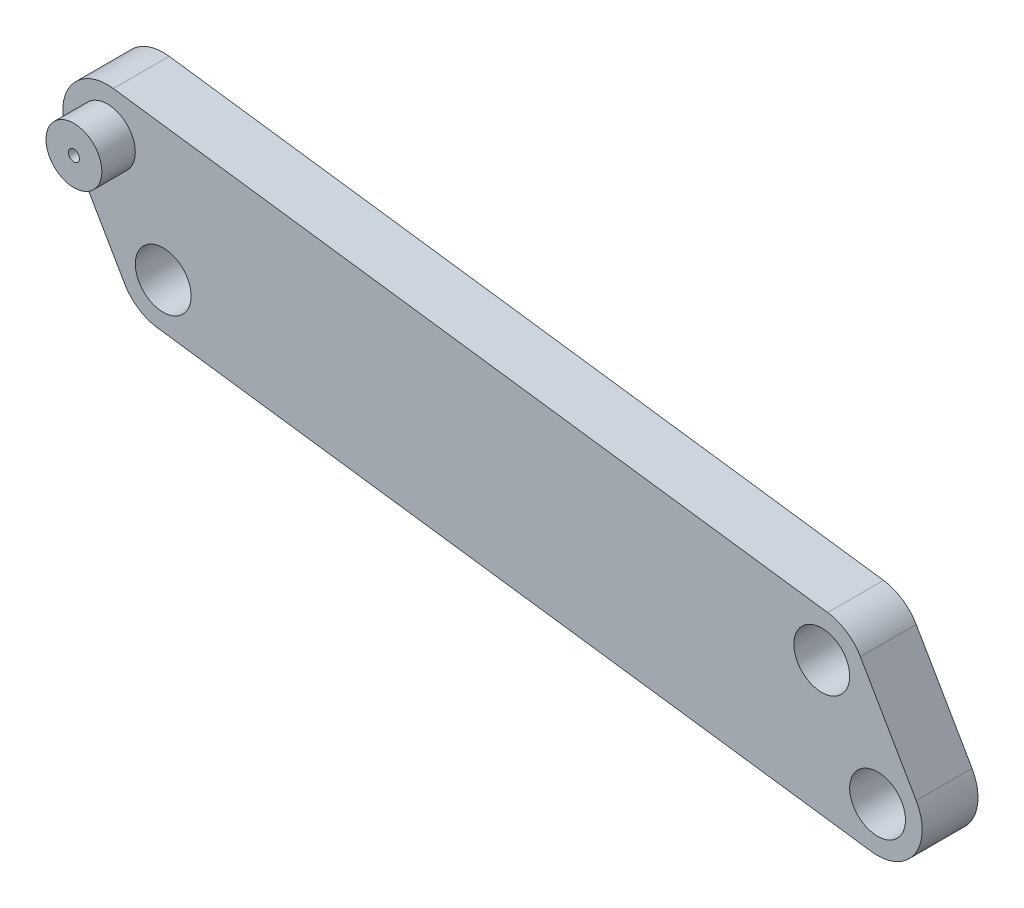
ISO-10303-21;
HEADER;
FILE_DESCRIPTION(('STEP AP214'),'2;1');
FILE_NAME('part.step','',(''),(''),'','','');
FILE_SCHEMA(('AUTOMOTIVE_DESIGN { 1 0 10303 214 1 1 1 1 }'));
ENDSEC;
DATA;
#1=APPLICATION_CONTEXT('core data for automotive mechanical design processes');
#2=APPLICATION_PROTOCOL_DEFINITION('international standard','automotive_design',2000,#1);
#3=PRODUCT_CONTEXT('',#1,'mechanical');
#4=PRODUCT('Part','Part','',(#3));
#5=PRODUCT_RELATED_PRODUCT_CATEGORY('part','',(#4));
#6=PRODUCT_DEFINITION_FORMATION('','',#4);
#7=PRODUCT_DEFINITION_CONTEXT('part definition',#1,'design');
#8=PRODUCT_DEFINITION('design','',#6,#7);
#9=PRODUCT_DEFINITION_SHAPE('','',#8);
#10=(LENGTH_UNIT() NAMED_UNIT(*) SI_UNIT(.MILLI.,.METRE.));
#11=(NAMED_UNIT(*) PLANE_ANGLE_UNIT() SI_UNIT($,.RADIAN.));
#12=(NAMED_UNIT(*) SI_UNIT($,.STERADIAN.) SOLID_ANGLE_UNIT());
#13=UNCERTAINTY_MEASURE_WITH_UNIT(LENGTH_MEASURE(1.E-05),#10,'distance_accuracy_value','');
#14=(GEOMETRIC_REPRESENTATION_CONTEXT(3) GLOBAL_UNCERTAINTY_ASSIGNED_CONTEXT((#13)) GLOBAL_UNIT_ASSIGNED_CONTEXT((#10,
#11,#12)) REPRESENTATION_CONTEXT('',''));
#15=CARTESIAN_POINT('',(0.,0.,0.));
#16=DIRECTION('',(0.,0.,1.));
#17=DIRECTION('',(1.,0.,0.));
#18=AXIS2_PLACEMENT_3D('',#15,#16,#17);
#19=CARTESIAN_POINT('',(-59.,0.,5.));
#20=DIRECTION('',(0.,0.,1.));
#21=DIRECTION('',(1.,0.,0.));
#22=AXIS2_PLACEMENT_3D('',#19,#20,#21);
#23=PLANE('',#22);
#24=CARTESIAN_POINT('',(0.,0.,5.));
#25=DIRECTION('',(0.,0.,1.));
#26=DIRECTION('',(1.,0.,0.));
#27=AXIS2_PLACEMENT_3D('',#24,#25,#26);
#28=CIRCLE('',#27,2.5);
#29=CARTESIAN_POINT('',(2.5,0.,5.));
#30=VERTEX_POINT('',#29);
#31=EDGE_CURVE('E220',#30,#30,#28,.T.);
#32=ORIENTED_EDGE('',*,*,#31,.F.);
#33=EDGE_LOOP('',(#32));
#34=FACE_BOUND('',#33,.T.);
#35=CARTESIAN_POINT('',(-59.,0.,5.));
#36=DIRECTION('',(0.,0.,1.));
#37=DIRECTION('',(1.,0.,0.));
#38=AXIS2_PLACEMENT_3D('',#35,#36,#37);
#39=CIRCLE('',#38,2.5);
#40=CARTESIAN_POINT('',(-56.5,0.,5.));
#41=VERTEX_POINT('',#40);
#42=EDGE_CURVE('E146',#41,#41,#39,.T.);
#43=ORIENTED_EDGE('',*,*,#42,.F.);
#44=EDGE_LOOP('',(#43));
#45=FACE_BOUND('',#44,.T.);
#46=CARTESIAN_POINT('',(-59.,0.,5.));
#47=DIRECTION('',(0.,0.,1.));
#48=DIRECTION('',(1.,0.,0.));
#49=AXIS2_PLACEMENT_3D('',#46,#47,#48);
#50=CIRCLE('',#49,4.00000000000001);
#51=CARTESIAN_POINT('',(-62.4641016151378,-2.00000000000001,5.));
#52=VERTEX_POINT('',#51);
#53=CARTESIAN_POINT('',(-59.5363774707957,-3.96387426753459,5.));
#54=VERTEX_POINT('',#53);
#55=EDGE_CURVE('E164',#52,#54,#50,.T.);
#56=ORIENTED_EDGE('',*,*,#55,.T.);
#57=DIRECTION('',(0.990968566883646,-0.134094367698921,0.));
#58=VECTOR('',#57,1.);
#59=CARTESIAN_POINT('',(4.46362252920436,-12.6241283053789,5.));
#60=LINE('',#59,#58);
#61=CARTESIAN_POINT('',(4.46362252920436,-12.6241283053789,5.));
#62=VERTEX_POINT('',#61);
#63=EDGE_CURVE('E100',#54,#62,#60,.T.);
#64=ORIENTED_EDGE('',*,*,#63,.T.);
#65=CARTESIAN_POINT('',(5.00000000000004,-8.66025403784436,5.));
#66=DIRECTION('',(0.,0.,1.));
#67=DIRECTION('',(1.,0.,0.));
#68=AXIS2_PLACEMENT_3D('',#65,#66,#67);
#69=CIRCLE('',#68,4.);
#70=CARTESIAN_POINT('',(8.46410161513779,-6.66025403784434,5.));
#71=VERTEX_POINT('',#70);
#72=EDGE_CURVE('E185',#62,#71,#69,.T.);
#73=ORIENTED_EDGE('',*,*,#72,.T.);
#74=DIRECTION('',(-0.500000000000005,0.866025403784436,0.));
#75=VECTOR('',#74,1.);
#76=CARTESIAN_POINT('',(3.46410161513775,2.00000000000002,5.));
#77=LINE('',#76,#75);
#78=CARTESIAN_POINT('',(3.46410161513774,2.00000000000002,5.));
#79=VERTEX_POINT('',#78);
#80=EDGE_CURVE('E199',#71,#79,#77,.T.);
#81=ORIENTED_EDGE('',*,*,#80,.T.);
#82=CARTESIAN_POINT('',(0.,0.,5.));
#83=DIRECTION('',(0.,0.,1.));
#84=DIRECTION('',(1.,0.,0.));
#85=AXIS2_PLACEMENT_3D('',#82,#83,#84);
#86=CIRCLE('',#85,4.);
#87=CARTESIAN_POINT('',(0.536377470795685,3.96387426753458,5.));
#88=VERTEX_POINT('',#87);
#89=EDGE_CURVE('E119',#79,#88,#86,.T.);
#90=ORIENTED_EDGE('',*,*,#89,.T.);
#91=DIRECTION('',(-0.990968566883646,0.134094367698921,0.));
#92=VECTOR('',#91,1.);
#93=CARTESIAN_POINT('',(-63.4636225292043,12.624128305379,5.));
#94=LINE('',#93,#92);
#95=CARTESIAN_POINT('',(-63.4636225292043,12.624128305379,5.));
#96=VERTEX_POINT('',#95);
#97=EDGE_CURVE('E113',#88,#96,#94,.T.);
#98=ORIENTED_EDGE('',*,*,#97,.T.);
#99=CARTESIAN_POINT('',(-64.,8.66025403784439,5.));
#100=DIRECTION('',(0.,0.,1.));
#101=DIRECTION('',(1.,0.,0.));
#102=AXIS2_PLACEMENT_3D('',#99,#100,#101);
#103=CIRCLE('',#102,4.);
#104=CARTESIAN_POINT('',(-67.4641016151377,6.6602540378444,5.));
#105=VERTEX_POINT('',#104);
#106=EDGE_CURVE('E117',#96,#105,#103,.T.);
#107=ORIENTED_EDGE('',*,*,#106,.T.);
#108=DIRECTION('',(0.499999999999997,-0.86602540378444,0.));
#109=VECTOR('',#108,1.);
#110=CARTESIAN_POINT('',(-62.4641016151378,-2.00000000000001,5.));
#111=LINE('',#110,#109);
#112=EDGE_CURVE('E57',#105,#52,#111,.T.);
#113=ORIENTED_EDGE('',*,*,#112,.T.);
#114=EDGE_LOOP('',(#56,#64,#73,#81,#90,#98,#107,#113));
#115=FACE_BOUND('',#114,.T.);
#116=CARTESIAN_POINT('',(-64.,8.66025403784439,5.));
#117=DIRECTION('',(0.,0.,1.));
#118=DIRECTION('',(1.,0.,0.));
#119=AXIS2_PLACEMENT_3D('',#116,#117,#118);
#120=CIRCLE('',#119,2.5);
#121=CARTESIAN_POINT('',(-61.5,8.66025403784439,5.));
#122=VERTEX_POINT('',#121);
#123=EDGE_CURVE('E213',#122,#122,#120,.T.);
#124=ORIENTED_EDGE('',*,*,#123,.F.);
#125=EDGE_LOOP('',(#124));
#126=FACE_BOUND('',#125,.T.);
#127=CARTESIAN_POINT('',(5.00000000000004,-8.66025403784436,5.));
#128=DIRECTION('',(0.,0.,1.));
#129=DIRECTION('',(1.,0.,0.));
#130=AXIS2_PLACEMENT_3D('',#127,#128,#129);
#131=CIRCLE('',#130,2.5);
#132=CARTESIAN_POINT('',(7.50000000000004,-8.66025403784436,5.));
#133=VERTEX_POINT('',#132);
#134=EDGE_CURVE('E225',#133,#133,#131,.T.);
#135=ORIENTED_EDGE('',*,*,#134,.F.);
#136=EDGE_LOOP('',(#135));
#137=FACE_BOUND('',#136,.T.);
#138=ADVANCED_FACE('F39',(#34,#45,#115,#126,#137),#23,.T.);
#139=CARTESIAN_POINT('',(-59.,0.,0.));
#140=DIRECTION('',(0.,0.,1.));
#141=DIRECTION('',(1.,0.,0.));
#142=AXIS2_PLACEMENT_3D('',#139,#140,#141);
#143=PLANE('',#142);
#144=CARTESIAN_POINT('',(-59.,0.,0.));
#145=DIRECTION('',(0.,0.,1.));
#146=DIRECTION('',(1.,0.,0.));
#147=AXIS2_PLACEMENT_3D('',#144,#145,#146);
#148=CIRCLE('',#147,4.00000000000001);
#149=CARTESIAN_POINT('',(-62.4641016151378,-2.00000000000001,0.));
#150=VERTEX_POINT('',#149);
#151=CARTESIAN_POINT('',(-59.5363774707957,-3.96387426753459,0.));
#152=VERTEX_POINT('',#151);
#153=EDGE_CURVE('E141',#150,#152,#148,.T.);
#154=ORIENTED_EDGE('',*,*,#153,.F.);
#155=DIRECTION('',(0.499999999999997,-0.86602540378444,0.));
#156=VECTOR('',#155,1.);
#157=CARTESIAN_POINT('',(-62.4641016151378,-2.00000000000001,0.));
#158=LINE('',#157,#156);
#159=CARTESIAN_POINT('',(-67.4641016151377,6.6602540378444,0.));
#160=VERTEX_POINT('',#159);
#161=EDGE_CURVE('E92',#160,#150,#158,.T.);
#162=ORIENTED_EDGE('',*,*,#161,.F.);
#163=CARTESIAN_POINT('',(-64.,8.66025403784439,0.));
#164=DIRECTION('',(0.,0.,1.));
#165=DIRECTION('',(1.,0.,0.));
#166=AXIS2_PLACEMENT_3D('',#163,#164,#165);
#167=CIRCLE('',#166,4.);
#168=CARTESIAN_POINT('',(-63.4636225292043,12.624128305379,0.));
#169=VERTEX_POINT('',#168);
#170=EDGE_CURVE('E86',#169,#160,#167,.T.);
#171=ORIENTED_EDGE('',*,*,#170,.F.);
#172=DIRECTION('',(-0.990968566883646,0.134094367698921,0.));
#173=VECTOR('',#172,1.);
#174=CARTESIAN_POINT('',(-63.4636225292043,12.624128305379,0.));
#175=LINE('',#174,#173);
#176=CARTESIAN_POINT('',(0.536377470795685,3.96387426753458,0.));
#177=VERTEX_POINT('',#176);
#178=EDGE_CURVE('E128',#177,#169,#175,.T.);
#179=ORIENTED_EDGE('',*,*,#178,.F.);
#180=CARTESIAN_POINT('',(0.,0.,0.));
#181=DIRECTION('',(0.,0.,1.));
#182=DIRECTION('',(1.,0.,0.));
#183=AXIS2_PLACEMENT_3D('',#180,#181,#182);
#184=CIRCLE('',#183,4.);
#185=CARTESIAN_POINT('',(3.46410161513774,2.00000000000002,0.));
#186=VERTEX_POINT('',#185);
#187=EDGE_CURVE('E155',#186,#177,#184,.T.);
#188=ORIENTED_EDGE('',*,*,#187,.F.);
#189=DIRECTION('',(-0.500000000000005,0.866025403784436,0.));
#190=VECTOR('',#189,1.);
#191=CARTESIAN_POINT('',(3.46410161513775,2.00000000000002,0.));
#192=LINE('',#191,#190);
#193=CARTESIAN_POINT('',(8.46410161513779,-6.66025403784434,0.));
#194=VERTEX_POINT('',#193);
#195=EDGE_CURVE('E152',#194,#186,#192,.T.);
#196=ORIENTED_EDGE('',*,*,#195,.F.);
#197=CARTESIAN_POINT('',(5.00000000000004,-8.66025403784436,0.));
#198=DIRECTION('',(0.,0.,1.));
#199=DIRECTION('',(1.,0.,0.));
#200=AXIS2_PLACEMENT_3D('',#197,#198,#199);
#201=CIRCLE('',#200,4.);
#202=CARTESIAN_POINT('',(4.46362252920436,-12.6241283053789,0.));
#203=VERTEX_POINT('',#202);
#204=EDGE_CURVE('E149',#203,#194,#201,.T.);
#205=ORIENTED_EDGE('',*,*,#204,.F.);
#206=DIRECTION('',(0.990968566883646,-0.134094367698921,0.));
#207=VECTOR('',#206,1.);
#208=CARTESIAN_POINT('',(4.46362252920436,-12.6241283053789,0.));
#209=LINE('',#208,#207);
#210=EDGE_CURVE('E145',#152,#203,#209,.T.);
#211=ORIENTED_EDGE('',*,*,#210,.F.);
#212=EDGE_LOOP('',(#154,#162,#171,#179,#188,#196,#205,#211));
#213=FACE_BOUND('',#212,.T.);
#214=CARTESIAN_POINT('',(-59.,0.,0.));
#215=DIRECTION('',(0.,0.,1.));
#216=DIRECTION('',(1.,0.,0.));
#217=AXIS2_PLACEMENT_3D('',#214,#215,#216);
#218=CIRCLE('',#217,2.5);
#219=CARTESIAN_POINT('',(-56.5,0.,0.));
#220=VERTEX_POINT('',#219);
#221=EDGE_CURVE('E209',#220,#220,#218,.T.);
#222=ORIENTED_EDGE('',*,*,#221,.T.);
#223=EDGE_LOOP('',(#222));
#224=FACE_BOUND('',#223,.T.);
#225=CARTESIAN_POINT('',(0.,0.,0.));
#226=DIRECTION('',(0.,0.,1.));
#227=DIRECTION('',(1.,0.,0.));
#228=AXIS2_PLACEMENT_3D('',#225,#226,#227);
#229=CIRCLE('',#228,2.5);
#230=CARTESIAN_POINT('',(2.5,0.,0.));
#231=VERTEX_POINT('',#230);
#232=EDGE_CURVE('E221',#231,#231,#229,.T.);
#233=ORIENTED_EDGE('',*,*,#232,.T.);
#234=EDGE_LOOP('',(#233));
#235=FACE_BOUND('',#234,.T.);
#236=CARTESIAN_POINT('',(5.00000000000004,-8.66025403784436,0.));
#237=DIRECTION('',(0.,0.,1.));
#238=DIRECTION('',(1.,0.,0.));
#239=AXIS2_PLACEMENT_3D('',#236,#237,#238);
#240=CIRCLE('',#239,2.5);
#241=CARTESIAN_POINT('',(7.50000000000004,-8.66025403784436,0.));
#242=VERTEX_POINT('',#241);
#243=EDGE_CURVE('E229',#242,#242,#240,.T.);
#244=ORIENTED_EDGE('',*,*,#243,.T.);
#245=EDGE_LOOP('',(#244));
#246=FACE_BOUND('',#245,.T.);
#247=CARTESIAN_POINT('',(-64.,8.66025403784439,0.));
#248=DIRECTION('',(0.,0.,-1.));
#249=DIRECTION('',(-1.,0.,0.));
#250=AXIS2_PLACEMENT_3D('',#247,#248,#249);
#251=CIRCLE('',#250,0.499999999999999);
#252=CARTESIAN_POINT('',(-64.5,8.66025403784439,0.));
#253=VERTEX_POINT('',#252);
#254=EDGE_CURVE('E241',#253,#253,#251,.T.);
#255=ORIENTED_EDGE('',*,*,#254,.F.);
#256=EDGE_LOOP('',(#255));
#257=FACE_BOUND('',#256,.T.);
#258=ADVANCED_FACE('F189',(#213,#224,#235,#246,#257),#143,.F.);
#259=CARTESIAN_POINT('',(-59.,0.,5.));
#260=DIRECTION('',(0.,0.,-1.));
#261=DIRECTION('',(-1.,0.,0.));
#262=AXIS2_PLACEMENT_3D('',#259,#260,#261);
#263=CYLINDRICAL_SURFACE('',#262,4.00000000000001);
#264=ORIENTED_EDGE('',*,*,#153,.T.);
#265=DIRECTION('',(0.,0.,-1.));
#266=VECTOR('',#265,1.);
#267=CARTESIAN_POINT('',(-59.5363774707957,-3.96387426753459,5.));
#268=LINE('',#267,#266);
#269=EDGE_CURVE('E11',#54,#152,#268,.T.);
#270=ORIENTED_EDGE('',*,*,#269,.F.);
#271=ORIENTED_EDGE('',*,*,#55,.F.);
#272=DIRECTION('',(0.,0.,-1.));
#273=VECTOR('',#272,1.);
#274=CARTESIAN_POINT('',(-62.4641016151378,-2.00000000000001,5.));
#275=LINE('',#274,#273);
#276=EDGE_CURVE('E137',#52,#150,#275,.T.);
#277=ORIENTED_EDGE('',*,*,#276,.T.);
#278=EDGE_LOOP('',(#264,#270,#271,#277));
#279=FACE_BOUND('',#278,.T.);
#280=ADVANCED_FACE('F41',(#279),#263,.T.);
#281=CARTESIAN_POINT('',(4.46362252920436,-12.6241283053789,5.));
#282=DIRECTION('',(0.134094367698921,0.990968566883646,0.));
#283=DIRECTION('',(-0.990968566883646,0.134094367698921,0.));
#284=AXIS2_PLACEMENT_3D('',#281,#282,#283);
#285=PLANE('',#284);
#286=ORIENTED_EDGE('',*,*,#210,.T.);
#287=DIRECTION('',(0.,0.,-1.));
#288=VECTOR('',#287,1.);
#289=CARTESIAN_POINT('',(4.46362252920436,-12.6241283053789,5.));
#290=LINE('',#289,#288);
#291=EDGE_CURVE('E49',#62,#203,#290,.T.);
#292=ORIENTED_EDGE('',*,*,#291,.F.);
#293=ORIENTED_EDGE('',*,*,#63,.F.);
#294=ORIENTED_EDGE('',*,*,#269,.T.);
#295=EDGE_LOOP('',(#286,#292,#293,#294));
#296=FACE_BOUND('',#295,.T.);
#297=ADVANCED_FACE('F264',(#296),#285,.F.);
#298=CARTESIAN_POINT('',(5.00000000000004,-8.66025403784436,5.));
#299=DIRECTION('',(0.,0.,-1.));
#300=DIRECTION('',(-1.,0.,0.));
#301=AXIS2_PLACEMENT_3D('',#298,#299,#300);
#302=CYLINDRICAL_SURFACE('',#301,4.);
#303=ORIENTED_EDGE('',*,*,#204,.T.);
#304=DIRECTION('',(0.,0.,-1.));
#305=VECTOR('',#304,1.);
#306=CARTESIAN_POINT('',(8.46410161513779,-6.66025403784434,5.));
#307=LINE('',#306,#305);
#308=EDGE_CURVE('E175',#71,#194,#307,.T.);
#309=ORIENTED_EDGE('',*,*,#308,.F.);
#310=ORIENTED_EDGE('',*,*,#72,.F.);
#311=ORIENTED_EDGE('',*,*,#291,.T.);
#312=EDGE_LOOP('',(#303,#309,#310,#311));
#313=FACE_BOUND('',#312,.T.);
#314=ADVANCED_FACE('F183',(#313),#302,.T.);
#315=CARTESIAN_POINT('',(3.46410161513775,2.00000000000002,5.));
#316=DIRECTION('',(-0.866025403784436,-0.500000000000005,0.));
#317=DIRECTION('',(0.500000000000005,-0.866025403784436,0.));
#318=AXIS2_PLACEMENT_3D('',#315,#316,#317);
#319=PLANE('',#318);
#320=ORIENTED_EDGE('',*,*,#195,.T.);
#321=DIRECTION('',(0.,0.,-1.));
#322=VECTOR('',#321,1.);
#323=CARTESIAN_POINT('',(3.46410161513774,2.00000000000002,5.));
#324=LINE('',#323,#322);
#325=EDGE_CURVE('E171',#79,#186,#324,.T.);
#326=ORIENTED_EDGE('',*,*,#325,.F.);
#327=ORIENTED_EDGE('',*,*,#80,.F.);
#328=ORIENTED_EDGE('',*,*,#308,.T.);
#329=EDGE_LOOP('',(#320,#326,#327,#328));
#330=FACE_BOUND('',#329,.T.);
#331=ADVANCED_FACE('F194',(#330),#319,.F.);
#332=CARTESIAN_POINT('',(0.,0.,5.));
#333=DIRECTION('',(0.,0.,-1.));
#334=DIRECTION('',(-1.,0.,0.));
#335=AXIS2_PLACEMENT_3D('',#332,#333,#334);
#336=CYLINDRICAL_SURFACE('',#335,4.);
#337=ORIENTED_EDGE('',*,*,#187,.T.);
#338=DIRECTION('',(0.,0.,-1.));
#339=VECTOR('',#338,1.);
#340=CARTESIAN_POINT('',(0.536377470795685,3.96387426753458,5.));
#341=LINE('',#340,#339);
#342=EDGE_CURVE('E130',#88,#177,#341,.T.);
#343=ORIENTED_EDGE('',*,*,#342,.F.);
#344=ORIENTED_EDGE('',*,*,#89,.F.);
#345=ORIENTED_EDGE('',*,*,#325,.T.);
#346=EDGE_LOOP('',(#337,#343,#344,#345));
#347=FACE_BOUND('',#346,.T.);
#348=ADVANCED_FACE('F197',(#347),#336,.T.);
#349=CARTESIAN_POINT('',(-63.4636225292043,12.624128305379,5.));
#350=DIRECTION('',(-0.134094367698921,-0.990968566883646,0.));
#351=DIRECTION('',(0.990968566883646,-0.134094367698921,0.));
#352=AXIS2_PLACEMENT_3D('',#349,#350,#351);
#353=PLANE('',#352);
#354=ORIENTED_EDGE('',*,*,#178,.T.);
#355=DIRECTION('',(0.,0.,-1.));
#356=VECTOR('',#355,1.);
#357=CARTESIAN_POINT('',(-63.4636225292043,12.624128305379,5.));
#358=LINE('',#357,#356);
#359=EDGE_CURVE('E125',#96,#169,#358,.T.);
#360=ORIENTED_EDGE('',*,*,#359,.F.);
#361=ORIENTED_EDGE('',*,*,#97,.F.);
#362=ORIENTED_EDGE('',*,*,#342,.T.);
#363=EDGE_LOOP('',(#354,#360,#361,#362));
#364=FACE_BOUND('',#363,.T.);
#365=ADVANCED_FACE('F126',(#364),#353,.F.);
#366=CARTESIAN_POINT('',(-64.,8.66025403784439,5.));
#367=DIRECTION('',(0.,0.,-1.));
#368=DIRECTION('',(-1.,0.,0.));
#369=AXIS2_PLACEMENT_3D('',#366,#367,#368);
#370=CYLINDRICAL_SURFACE('',#369,4.);
#371=ORIENTED_EDGE('',*,*,#170,.T.);
#372=DIRECTION('',(0.,0.,-1.));
#373=VECTOR('',#372,1.);
#374=CARTESIAN_POINT('',(-67.4641016151377,6.6602540378444,5.));
#375=LINE('',#374,#373);
#376=EDGE_CURVE('E131',#105,#160,#375,.T.);
#377=ORIENTED_EDGE('',*,*,#376,.F.);
#378=ORIENTED_EDGE('',*,*,#106,.F.);
#379=ORIENTED_EDGE('',*,*,#359,.T.);
#380=EDGE_LOOP('',(#371,#377,#378,#379));
#381=FACE_BOUND('',#380,.T.);
#382=ADVANCED_FACE('F133',(#381),#370,.T.);
#383=CARTESIAN_POINT('',(-62.4641016151378,-2.00000000000001,5.));
#384=DIRECTION('',(0.86602540378444,0.499999999999997,0.));
#385=DIRECTION('',(-0.499999999999997,0.86602540378444,0.));
#386=AXIS2_PLACEMENT_3D('',#383,#384,#385);
#387=PLANE('',#386);
#388=ORIENTED_EDGE('',*,*,#161,.T.);
#389=ORIENTED_EDGE('',*,*,#276,.F.);
#390=ORIENTED_EDGE('',*,*,#112,.F.);
#391=ORIENTED_EDGE('',*,*,#376,.T.);
#392=EDGE_LOOP('',(#388,#389,#390,#391));
#393=FACE_BOUND('',#392,.T.);
#394=ADVANCED_FACE('F270',(#393),#387,.F.);
#395=CARTESIAN_POINT('',(-59.,0.,5.));
#396=DIRECTION('',(0.,0.,-1.));
#397=DIRECTION('',(-1.,0.,0.));
#398=AXIS2_PLACEMENT_3D('',#395,#396,#397);
#399=CYLINDRICAL_SURFACE('',#398,2.5);
#400=ORIENTED_EDGE('',*,*,#42,.T.);
#401=EDGE_LOOP('',(#400));
#402=FACE_BOUND('',#401,.T.);
#403=ORIENTED_EDGE('',*,*,#221,.F.);
#404=EDGE_LOOP('',(#403));
#405=FACE_BOUND('',#404,.T.);
#406=ADVANCED_FACE('F273',(#402,#405),#399,.F.);
#407=CARTESIAN_POINT('',(0.,0.,5.));
#408=DIRECTION('',(0.,0.,-1.));
#409=DIRECTION('',(-1.,0.,0.));
#410=AXIS2_PLACEMENT_3D('',#407,#408,#409);
#411=CYLINDRICAL_SURFACE('',#410,2.5);
#412=ORIENTED_EDGE('',*,*,#31,.T.);
#413=EDGE_LOOP('',(#412));
#414=FACE_BOUND('',#413,.T.);
#415=ORIENTED_EDGE('',*,*,#232,.F.);
#416=EDGE_LOOP('',(#415));
#417=FACE_BOUND('',#416,.T.);
#418=ADVANCED_FACE('F320',(#414,#417),#411,.F.);
#419=CARTESIAN_POINT('',(5.00000000000004,-8.66025403784436,5.));
#420=DIRECTION('',(0.,0.,-1.));
#421=DIRECTION('',(-1.,0.,0.));
#422=AXIS2_PLACEMENT_3D('',#419,#420,#421);
#423=CYLINDRICAL_SURFACE('',#422,2.5);
#424=ORIENTED_EDGE('',*,*,#134,.T.);
#425=EDGE_LOOP('',(#424));
#426=FACE_BOUND('',#425,.T.);
#427=ORIENTED_EDGE('',*,*,#243,.F.);
#428=EDGE_LOOP('',(#427));
#429=FACE_BOUND('',#428,.T.);
#430=ADVANCED_FACE('F327',(#426,#429),#423,.F.);
#431=CARTESIAN_POINT('',(-64.,8.66025403784439,8.));
#432=DIRECTION('',(0.,0.,-1.));
#433=DIRECTION('',(-1.,0.,0.));
#434=AXIS2_PLACEMENT_3D('',#431,#432,#433);
#435=CYLINDRICAL_SURFACE('',#434,2.50000000000001);
#436=ORIENTED_EDGE('',*,*,#123,.T.);
#437=EDGE_LOOP('',(#436));
#438=FACE_BOUND('',#437,.T.);
#439=CARTESIAN_POINT('',(-64.,8.66025403784439,8.));
#440=DIRECTION('',(0.,0.,-1.));
#441=DIRECTION('',(-1.,0.,0.));
#442=AXIS2_PLACEMENT_3D('',#439,#440,#441);
#443=CIRCLE('',#442,2.50000000000001);
#444=CARTESIAN_POINT('',(-66.5,8.66025403784439,8.));
#445=VERTEX_POINT('',#444);
#446=EDGE_CURVE('E233',#445,#445,#443,.T.);
#447=ORIENTED_EDGE('',*,*,#446,.T.);
#448=EDGE_LOOP('',(#447));
#449=FACE_BOUND('',#448,.T.);
#450=ADVANCED_FACE('F335',(#438,#449),#435,.T.);
#451=CARTESIAN_POINT('',(-64.,8.66025403784439,8.));
#452=DIRECTION('',(0.,0.,-1.));
#453=DIRECTION('',(-1.,0.,0.));
#454=AXIS2_PLACEMENT_3D('',#451,#452,#453);
#455=PLANE('',#454);
#456=CARTESIAN_POINT('',(-64.,8.66025403784439,8.));
#457=DIRECTION('',(0.,0.,-1.));
#458=DIRECTION('',(-1.,0.,0.));
#459=AXIS2_PLACEMENT_3D('',#456,#457,#458);
#460=CIRCLE('',#459,0.499999999999999);
#461=CARTESIAN_POINT('',(-64.5,8.66025403784439,8.));
#462=VERTEX_POINT('',#461);
#463=EDGE_CURVE('E240',#462,#462,#460,.T.);
#464=ORIENTED_EDGE('',*,*,#463,.T.);
#465=EDGE_LOOP('',(#464));
#466=FACE_BOUND('',#465,.T.);
#467=ORIENTED_EDGE('',*,*,#446,.F.);
#468=EDGE_LOOP('',(#467));
#469=FACE_BOUND('',#468,.T.);
#470=ADVANCED_FACE('F249',(#466,#469),#455,.F.);
#471=CARTESIAN_POINT('',(-64.,8.66025403784439,8.));
#472=DIRECTION('',(0.,0.,-1.));
#473=DIRECTION('',(-1.,0.,0.));
#474=AXIS2_PLACEMENT_3D('',#471,#472,#473);
#475=CYLINDRICAL_SURFACE('',#474,0.499999999999999);
#476=ORIENTED_EDGE('',*,*,#463,.F.);
#477=EDGE_LOOP('',(#476));
#478=FACE_BOUND('',#477,.T.);
#479=ORIENTED_EDGE('',*,*,#254,.T.);
#480=EDGE_LOOP('',(#479));
#481=FACE_BOUND('',#480,.T.);
#482=ADVANCED_FACE('F252',(#478,#481),#475,.F.);
#483=CLOSED_SHELL('',(#138,#258,#280,#297,#314,#331,#348,#365,#382,#394,#406,#418,#430,#450,
#470,#482));
#484=MANIFOLD_SOLID_BREP('B2',#483);
#485=ADVANCED_BREP_SHAPE_REPRESENTATION('',(#18,#484),#14);
#486=SHAPE_DEFINITION_REPRESENTATION(#9,#485);
ENDSEC;
END-ISO-10303-21;
